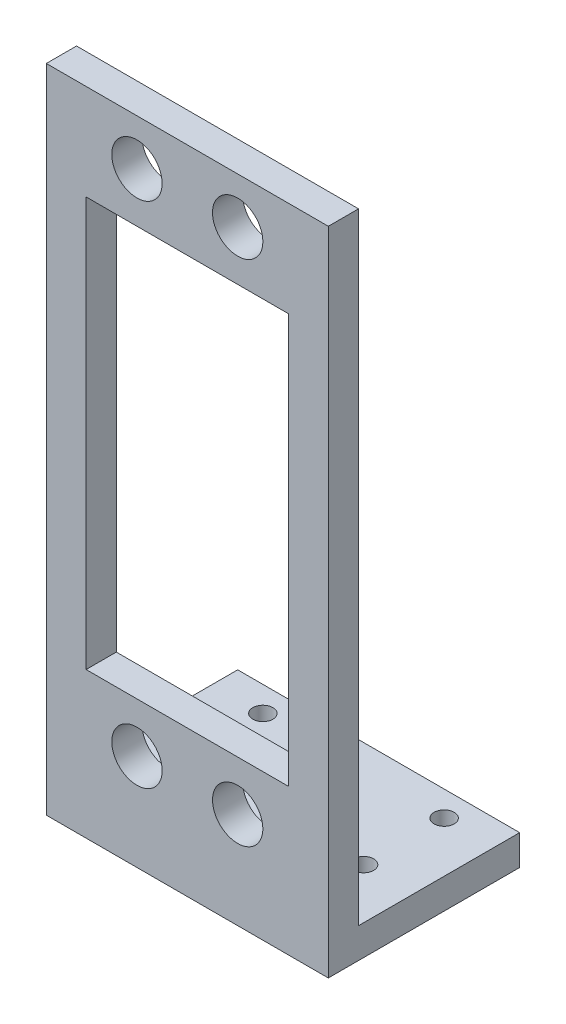
ISO-10303-21;
HEADER;
FILE_DESCRIPTION(('STEP AP214'),'2;1');
FILE_NAME('part.step','',(''),(''),'','','');
FILE_SCHEMA(('AUTOMOTIVE_DESIGN { 1 0 10303 214 1 1 1 1 }'));
ENDSEC;
DATA;
#1=APPLICATION_CONTEXT('core data for automotive mechanical design processes');
#2=APPLICATION_PROTOCOL_DEFINITION('international standard','automotive_design',2000,#1);
#3=PRODUCT_CONTEXT('',#1,'mechanical');
#4=PRODUCT('Part','Part','',(#3));
#5=PRODUCT_RELATED_PRODUCT_CATEGORY('part','',(#4));
#6=PRODUCT_DEFINITION_FORMATION('','',#4);
#7=PRODUCT_DEFINITION_CONTEXT('part definition',#1,'design');
#8=PRODUCT_DEFINITION('design','',#6,#7);
#9=PRODUCT_DEFINITION_SHAPE('','',#8);
#10=(LENGTH_UNIT() NAMED_UNIT(*) SI_UNIT(.MILLI.,.METRE.));
#11=(NAMED_UNIT(*) PLANE_ANGLE_UNIT() SI_UNIT($,.RADIAN.));
#12=(NAMED_UNIT(*) SI_UNIT($,.STERADIAN.) SOLID_ANGLE_UNIT());
#13=UNCERTAINTY_MEASURE_WITH_UNIT(LENGTH_MEASURE(1.E-05),#10,'distance_accuracy_value','');
#14=(GEOMETRIC_REPRESENTATION_CONTEXT(3) GLOBAL_UNCERTAINTY_ASSIGNED_CONTEXT((#13)) GLOBAL_UNIT_ASSIGNED_CONTEXT((#10,
#11,#12)) REPRESENTATION_CONTEXT('',''));
#15=CARTESIAN_POINT('',(0.,0.,0.));
#16=DIRECTION('',(0.,0.,1.));
#17=DIRECTION('',(1.,0.,0.));
#18=AXIS2_PLACEMENT_3D('',#15,#16,#17);
#19=CARTESIAN_POINT('',(0.,0.,0.));
#20=DIRECTION('',(0.,0.,1.));
#21=DIRECTION('',(1.,0.,0.));
#22=AXIS2_PLACEMENT_3D('',#19,#20,#21);
#23=PLANE('',#22);
#24=CARTESIAN_POINT('',(9.,9.57000000000001,0.));
#25=DIRECTION('',(0.,0.,1.));
#26=DIRECTION('',(1.,0.,0.));
#27=AXIS2_PLACEMENT_3D('',#24,#25,#26);
#28=CIRCLE('',#27,2.5);
#29=CARTESIAN_POINT('',(11.5,9.57000000000001,0.));
#30=VERTEX_POINT('',#29);
#31=EDGE_CURVE('E178',#30,#30,#28,.T.);
#32=ORIENTED_EDGE('',*,*,#31,.T.);
#33=EDGE_LOOP('',(#32));
#34=FACE_BOUND('',#33,.T.);
#35=CARTESIAN_POINT('',(19.,60.07,0.));
#36=DIRECTION('',(0.,0.,1.));
#37=DIRECTION('',(1.,0.,0.));
#38=AXIS2_PLACEMENT_3D('',#35,#36,#37);
#39=CIRCLE('',#38,2.5);
#40=CARTESIAN_POINT('',(21.5,60.07,0.));
#41=VERTEX_POINT('',#40);
#42=EDGE_CURVE('E160',#41,#41,#39,.T.);
#43=ORIENTED_EDGE('',*,*,#42,.T.);
#44=EDGE_LOOP('',(#43));
#45=FACE_BOUND('',#44,.T.);
#46=CARTESIAN_POINT('',(9.,60.07,0.));
#47=DIRECTION('',(0.,0.,1.));
#48=DIRECTION('',(1.,0.,0.));
#49=AXIS2_PLACEMENT_3D('',#46,#47,#48);
#50=CIRCLE('',#49,2.5);
#51=CARTESIAN_POINT('',(11.5,60.07,0.));
#52=VERTEX_POINT('',#51);
#53=EDGE_CURVE('E173',#52,#52,#50,.T.);
#54=ORIENTED_EDGE('',*,*,#53,.T.);
#55=EDGE_LOOP('',(#54));
#56=FACE_BOUND('',#55,.T.);
#57=CARTESIAN_POINT('',(19.,9.57000000000001,0.));
#58=DIRECTION('',(0.,0.,1.));
#59=DIRECTION('',(1.,0.,0.));
#60=AXIS2_PLACEMENT_3D('',#57,#58,#59);
#61=CIRCLE('',#60,2.49999999999999);
#62=CARTESIAN_POINT('',(21.5,9.57000000000001,0.));
#63=VERTEX_POINT('',#62);
#64=EDGE_CURVE('E166',#63,#63,#61,.T.);
#65=ORIENTED_EDGE('',*,*,#64,.T.);
#66=EDGE_LOOP('',(#65));
#67=FACE_BOUND('',#66,.T.);
#68=DIRECTION('',(1.,0.,0.));
#69=VECTOR('',#68,1.);
#70=CARTESIAN_POINT('',(0.,14.5,0.));
#71=LINE('',#70,#69);
#72=CARTESIAN_POINT('',(3.95,14.5,0.));
#73=VERTEX_POINT('',#72);
#74=CARTESIAN_POINT('',(24.05,14.5,0.));
#75=VERTEX_POINT('',#74);
#76=EDGE_CURVE('E42',#73,#75,#71,.T.);
#77=ORIENTED_EDGE('',*,*,#76,.T.);
#78=DIRECTION('',(0.,1.,0.));
#79=VECTOR('',#78,1.);
#80=CARTESIAN_POINT('',(24.05,0.,0.));
#81=LINE('',#80,#79);
#82=CARTESIAN_POINT('',(24.05,55.14,0.));
#83=VERTEX_POINT('',#82);
#84=EDGE_CURVE('E11',#75,#83,#81,.T.);
#85=ORIENTED_EDGE('',*,*,#84,.T.);
#86=DIRECTION('',(-1.,0.,0.));
#87=VECTOR('',#86,1.);
#88=CARTESIAN_POINT('',(0.,55.14,0.));
#89=LINE('',#88,#87);
#90=CARTESIAN_POINT('',(3.95,55.14,0.));
#91=VERTEX_POINT('',#90);
#92=EDGE_CURVE('E206',#83,#91,#89,.T.);
#93=ORIENTED_EDGE('',*,*,#92,.T.);
#94=DIRECTION('',(0.,-1.,0.));
#95=VECTOR('',#94,1.);
#96=CARTESIAN_POINT('',(3.95,0.,0.));
#97=LINE('',#96,#95);
#98=EDGE_CURVE('E209',#91,#73,#97,.T.);
#99=ORIENTED_EDGE('',*,*,#98,.T.);
#100=EDGE_LOOP('',(#77,#85,#93,#99));
#101=FACE_BOUND('',#100,.T.);
#102=DIRECTION('',(1.,0.,0.));
#103=VECTOR('',#102,1.);
#104=CARTESIAN_POINT('',(0.,3.,0.));
#105=LINE('',#104,#103);
#106=CARTESIAN_POINT('',(0.,3.,0.));
#107=VERTEX_POINT('',#106);
#108=CARTESIAN_POINT('',(28.,3.,0.));
#109=VERTEX_POINT('',#108);
#110=EDGE_CURVE('E49',#107,#109,#105,.T.);
#111=ORIENTED_EDGE('',*,*,#110,.F.);
#112=DIRECTION('',(0.,-1.,0.));
#113=VECTOR('',#112,1.);
#114=CARTESIAN_POINT('',(0.,0.,0.));
#115=LINE('',#114,#113);
#116=CARTESIAN_POINT('',(0.,64.64,0.));
#117=VERTEX_POINT('',#116);
#118=EDGE_CURVE('E136',#117,#107,#115,.T.);
#119=ORIENTED_EDGE('',*,*,#118,.F.);
#120=DIRECTION('',(-1.,0.,0.));
#121=VECTOR('',#120,1.);
#122=CARTESIAN_POINT('',(0.,64.64,0.));
#123=LINE('',#122,#121);
#124=CARTESIAN_POINT('',(28.,64.64,0.));
#125=VERTEX_POINT('',#124);
#126=EDGE_CURVE('E195',#125,#117,#123,.T.);
#127=ORIENTED_EDGE('',*,*,#126,.F.);
#128=DIRECTION('',(0.,1.,0.));
#129=VECTOR('',#128,1.);
#130=CARTESIAN_POINT('',(28.,0.,0.));
#131=LINE('',#130,#129);
#132=EDGE_CURVE('E181',#109,#125,#131,.T.);
#133=ORIENTED_EDGE('',*,*,#132,.F.);
#134=EDGE_LOOP('',(#111,#119,#127,#133));
#135=FACE_BOUND('',#134,.T.);
#136=ADVANCED_FACE('F34',(#34,#45,#56,#67,#101,#135),#23,.F.);
#137=CARTESIAN_POINT('',(0.,0.,3.));
#138=DIRECTION('',(0.,1.,0.));
#139=DIRECTION('',(0.,0.,1.));
#140=AXIS2_PLACEMENT_3D('',#137,#138,#139);
#141=PLANE('',#140);
#142=CARTESIAN_POINT('',(23.,0.,-5.5));
#143=DIRECTION('',(0.,1.,0.));
#144=DIRECTION('',(0.,0.,1.));
#145=AXIS2_PLACEMENT_3D('',#142,#143,#144);
#146=CIRCLE('',#145,1.);
#147=CARTESIAN_POINT('',(23.,0.,-4.5));
#148=VERTEX_POINT('',#147);
#149=EDGE_CURVE('E269',#148,#148,#146,.T.);
#150=ORIENTED_EDGE('',*,*,#149,.T.);
#151=EDGE_LOOP('',(#150));
#152=FACE_BOUND('',#151,.T.);
#153=CARTESIAN_POINT('',(23.,0.,-13.5));
#154=DIRECTION('',(0.,1.,0.));
#155=DIRECTION('',(0.,0.,1.));
#156=AXIS2_PLACEMENT_3D('',#153,#154,#155);
#157=CIRCLE('',#156,1.);
#158=CARTESIAN_POINT('',(23.,0.,-12.5));
#159=VERTEX_POINT('',#158);
#160=EDGE_CURVE('E271',#159,#159,#157,.T.);
#161=ORIENTED_EDGE('',*,*,#160,.T.);
#162=EDGE_LOOP('',(#161));
#163=FACE_BOUND('',#162,.T.);
#164=CARTESIAN_POINT('',(5.,0.,-13.5));
#165=DIRECTION('',(0.,1.,0.));
#166=DIRECTION('',(0.,0.,1.));
#167=AXIS2_PLACEMENT_3D('',#164,#165,#166);
#168=CIRCLE('',#167,1.);
#169=CARTESIAN_POINT('',(5.,0.,-12.5));
#170=VERTEX_POINT('',#169);
#171=EDGE_CURVE('E275',#170,#170,#168,.T.);
#172=ORIENTED_EDGE('',*,*,#171,.T.);
#173=EDGE_LOOP('',(#172));
#174=FACE_BOUND('',#173,.T.);
#175=CARTESIAN_POINT('',(5.,0.,-5.5));
#176=DIRECTION('',(0.,1.,0.));
#177=DIRECTION('',(0.,0.,1.));
#178=AXIS2_PLACEMENT_3D('',#175,#176,#177);
#179=CIRCLE('',#178,0.999999999999998);
#180=CARTESIAN_POINT('',(5.,0.,-4.5));
#181=VERTEX_POINT('',#180);
#182=EDGE_CURVE('E280',#181,#181,#179,.T.);
#183=ORIENTED_EDGE('',*,*,#182,.T.);
#184=EDGE_LOOP('',(#183));
#185=FACE_BOUND('',#184,.T.);
#186=DIRECTION('',(0.,0.,-1.));
#187=VECTOR('',#186,1.);
#188=CARTESIAN_POINT('',(0.,0.,3.));
#189=LINE('',#188,#187);
#190=CARTESIAN_POINT('',(0.,0.,3.));
#191=VERTEX_POINT('',#190);
#192=CARTESIAN_POINT('',(0.,0.,-16.));
#193=VERTEX_POINT('',#192);
#194=EDGE_CURVE('E193',#191,#193,#189,.T.);
#195=ORIENTED_EDGE('',*,*,#194,.T.);
#196=DIRECTION('',(-1.,0.,0.));
#197=VECTOR('',#196,1.);
#198=CARTESIAN_POINT('',(0.,0.,-16.));
#199=LINE('',#198,#197);
#200=CARTESIAN_POINT('',(28.,0.,-16.));
#201=VERTEX_POINT('',#200);
#202=EDGE_CURVE('E130',#201,#193,#199,.T.);
#203=ORIENTED_EDGE('',*,*,#202,.F.);
#204=DIRECTION('',(0.,0.,-1.));
#205=VECTOR('',#204,1.);
#206=CARTESIAN_POINT('',(28.,0.,3.));
#207=LINE('',#206,#205);
#208=CARTESIAN_POINT('',(28.,0.,3.));
#209=VERTEX_POINT('',#208);
#210=EDGE_CURVE('E204',#209,#201,#207,.T.);
#211=ORIENTED_EDGE('',*,*,#210,.F.);
#212=DIRECTION('',(1.,0.,0.));
#213=VECTOR('',#212,1.);
#214=CARTESIAN_POINT('',(0.,0.,3.));
#215=LINE('',#214,#213);
#216=EDGE_CURVE('E184',#191,#209,#215,.T.);
#217=ORIENTED_EDGE('',*,*,#216,.F.);
#218=EDGE_LOOP('',(#195,#203,#211,#217));
#219=FACE_BOUND('',#218,.T.);
#220=ADVANCED_FACE('F36',(#152,#163,#174,#185,#219),#141,.F.);
#221=CARTESIAN_POINT('',(28.,0.,3.));
#222=DIRECTION('',(-1.,0.,0.));
#223=DIRECTION('',(0.,-1.,0.));
#224=AXIS2_PLACEMENT_3D('',#221,#222,#223);
#225=PLANE('',#224);
#226=ORIENTED_EDGE('',*,*,#210,.T.);
#227=DIRECTION('',(0.,-1.,0.));
#228=VECTOR('',#227,1.);
#229=CARTESIAN_POINT('',(28.,0.,-16.));
#230=LINE('',#229,#228);
#231=CARTESIAN_POINT('',(28.,3.,-16.));
#232=VERTEX_POINT('',#231);
#233=EDGE_CURVE('E123',#232,#201,#230,.T.);
#234=ORIENTED_EDGE('',*,*,#233,.F.);
#235=DIRECTION('',(0.,0.,1.));
#236=VECTOR('',#235,1.);
#237=CARTESIAN_POINT('',(28.,3.,-16.));
#238=LINE('',#237,#236);
#239=EDGE_CURVE('E119',#232,#109,#238,.T.);
#240=ORIENTED_EDGE('',*,*,#239,.T.);
#241=ORIENTED_EDGE('',*,*,#132,.T.);
#242=DIRECTION('',(0.,0.,-1.));
#243=VECTOR('',#242,1.);
#244=CARTESIAN_POINT('',(28.,64.64,3.));
#245=LINE('',#244,#243);
#246=CARTESIAN_POINT('',(28.,64.64,3.));
#247=VERTEX_POINT('',#246);
#248=EDGE_CURVE('E201',#247,#125,#245,.T.);
#249=ORIENTED_EDGE('',*,*,#248,.F.);
#250=DIRECTION('',(0.,1.,0.));
#251=VECTOR('',#250,1.);
#252=CARTESIAN_POINT('',(28.,0.,3.));
#253=LINE('',#252,#251);
#254=EDGE_CURVE('E187',#209,#247,#253,.T.);
#255=ORIENTED_EDGE('',*,*,#254,.F.);
#256=EDGE_LOOP('',(#226,#234,#240,#241,#249,#255));
#257=FACE_BOUND('',#256,.T.);
#258=ADVANCED_FACE('F248',(#257),#225,.F.);
#259=CARTESIAN_POINT('',(0.,64.64,3.));
#260=DIRECTION('',(0.,-1.,0.));
#261=DIRECTION('',(0.,0.,-1.));
#262=AXIS2_PLACEMENT_3D('',#259,#260,#261);
#263=PLANE('',#262);
#264=ORIENTED_EDGE('',*,*,#126,.T.);
#265=DIRECTION('',(0.,0.,-1.));
#266=VECTOR('',#265,1.);
#267=CARTESIAN_POINT('',(0.,64.64,3.));
#268=LINE('',#267,#266);
#269=CARTESIAN_POINT('',(0.,64.64,3.));
#270=VERTEX_POINT('',#269);
#271=EDGE_CURVE('E199',#270,#117,#268,.T.);
#272=ORIENTED_EDGE('',*,*,#271,.F.);
#273=DIRECTION('',(-1.,0.,0.));
#274=VECTOR('',#273,1.);
#275=CARTESIAN_POINT('',(0.,64.64,3.));
#276=LINE('',#275,#274);
#277=EDGE_CURVE('E189',#247,#270,#276,.T.);
#278=ORIENTED_EDGE('',*,*,#277,.F.);
#279=ORIENTED_EDGE('',*,*,#248,.T.);
#280=EDGE_LOOP('',(#264,#272,#278,#279));
#281=FACE_BOUND('',#280,.T.);
#282=ADVANCED_FACE('F256',(#281),#263,.F.);
#283=CARTESIAN_POINT('',(0.,0.,3.));
#284=DIRECTION('',(1.,0.,0.));
#285=DIRECTION('',(0.,0.,-1.));
#286=AXIS2_PLACEMENT_3D('',#283,#284,#285);
#287=PLANE('',#286);
#288=ORIENTED_EDGE('',*,*,#118,.T.);
#289=DIRECTION('',(0.,0.,1.));
#290=VECTOR('',#289,1.);
#291=CARTESIAN_POINT('',(0.,3.,-16.));
#292=LINE('',#291,#290);
#293=CARTESIAN_POINT('',(0.,3.,-16.));
#294=VERTEX_POINT('',#293);
#295=EDGE_CURVE('E117',#294,#107,#292,.T.);
#296=ORIENTED_EDGE('',*,*,#295,.F.);
#297=DIRECTION('',(0.,1.,0.));
#298=VECTOR('',#297,1.);
#299=CARTESIAN_POINT('',(0.,0.,-16.));
#300=LINE('',#299,#298);
#301=EDGE_CURVE('E124',#193,#294,#300,.T.);
#302=ORIENTED_EDGE('',*,*,#301,.F.);
#303=ORIENTED_EDGE('',*,*,#194,.F.);
#304=DIRECTION('',(0.,-1.,0.));
#305=VECTOR('',#304,1.);
#306=CARTESIAN_POINT('',(0.,0.,3.));
#307=LINE('',#306,#305);
#308=EDGE_CURVE('E191',#270,#191,#307,.T.);
#309=ORIENTED_EDGE('',*,*,#308,.F.);
#310=ORIENTED_EDGE('',*,*,#271,.T.);
#311=EDGE_LOOP('',(#288,#296,#302,#303,#309,#310));
#312=FACE_BOUND('',#311,.T.);
#313=ADVANCED_FACE('F134',(#312),#287,.F.);
#314=CARTESIAN_POINT('',(0.,0.,3.));
#315=DIRECTION('',(0.,0.,1.));
#316=DIRECTION('',(1.,0.,0.));
#317=AXIS2_PLACEMENT_3D('',#314,#315,#316);
#318=PLANE('',#317);
#319=DIRECTION('',(0.,1.,0.));
#320=VECTOR('',#319,1.);
#321=CARTESIAN_POINT('',(24.05,55.14,3.));
#322=LINE('',#321,#320);
#323=CARTESIAN_POINT('',(24.05,14.5,3.));
#324=VERTEX_POINT('',#323);
#325=CARTESIAN_POINT('',(24.05,55.14,3.));
#326=VERTEX_POINT('',#325);
#327=EDGE_CURVE('E57',#324,#326,#322,.T.);
#328=ORIENTED_EDGE('',*,*,#327,.F.);
#329=DIRECTION('',(1.,0.,0.));
#330=VECTOR('',#329,1.);
#331=CARTESIAN_POINT('',(24.05,14.5,3.));
#332=LINE('',#331,#330);
#333=CARTESIAN_POINT('',(3.95,14.5,3.));
#334=VERTEX_POINT('',#333);
#335=EDGE_CURVE('E148',#334,#324,#332,.T.);
#336=ORIENTED_EDGE('',*,*,#335,.F.);
#337=DIRECTION('',(0.,-1.,0.));
#338=VECTOR('',#337,1.);
#339=CARTESIAN_POINT('',(3.95,55.14,3.));
#340=LINE('',#339,#338);
#341=CARTESIAN_POINT('',(3.95,55.14,3.));
#342=VERTEX_POINT('',#341);
#343=EDGE_CURVE('E145',#342,#334,#340,.T.);
#344=ORIENTED_EDGE('',*,*,#343,.F.);
#345=DIRECTION('',(-1.,0.,0.));
#346=VECTOR('',#345,1.);
#347=CARTESIAN_POINT('',(24.05,55.14,3.));
#348=LINE('',#347,#346);
#349=EDGE_CURVE('E138',#326,#342,#348,.T.);
#350=ORIENTED_EDGE('',*,*,#349,.F.);
#351=EDGE_LOOP('',(#328,#336,#344,#350));
#352=FACE_BOUND('',#351,.T.);
#353=CARTESIAN_POINT('',(19.,9.57000000000001,3.));
#354=DIRECTION('',(0.,0.,1.));
#355=DIRECTION('',(1.,0.,0.));
#356=AXIS2_PLACEMENT_3D('',#353,#354,#355);
#357=CIRCLE('',#356,2.49999999999999);
#358=CARTESIAN_POINT('',(21.5,9.57000000000001,3.));
#359=VERTEX_POINT('',#358);
#360=EDGE_CURVE('E170',#359,#359,#357,.T.);
#361=ORIENTED_EDGE('',*,*,#360,.F.);
#362=EDGE_LOOP('',(#361));
#363=FACE_BOUND('',#362,.T.);
#364=CARTESIAN_POINT('',(9.,60.07,3.));
#365=DIRECTION('',(0.,0.,1.));
#366=DIRECTION('',(1.,0.,0.));
#367=AXIS2_PLACEMENT_3D('',#364,#365,#366);
#368=CIRCLE('',#367,2.5);
#369=CARTESIAN_POINT('',(11.5,60.07,3.));
#370=VERTEX_POINT('',#369);
#371=EDGE_CURVE('E163',#370,#370,#368,.T.);
#372=ORIENTED_EDGE('',*,*,#371,.F.);
#373=EDGE_LOOP('',(#372));
#374=FACE_BOUND('',#373,.T.);
#375=CARTESIAN_POINT('',(19.,60.07,3.));
#376=DIRECTION('',(0.,0.,1.));
#377=DIRECTION('',(1.,0.,0.));
#378=AXIS2_PLACEMENT_3D('',#375,#376,#377);
#379=CIRCLE('',#378,2.5);
#380=CARTESIAN_POINT('',(21.5,60.07,3.));
#381=VERTEX_POINT('',#380);
#382=EDGE_CURVE('E154',#381,#381,#379,.T.);
#383=ORIENTED_EDGE('',*,*,#382,.F.);
#384=EDGE_LOOP('',(#383));
#385=FACE_BOUND('',#384,.T.);
#386=CARTESIAN_POINT('',(9.,9.57000000000001,3.));
#387=DIRECTION('',(0.,0.,1.));
#388=DIRECTION('',(1.,0.,0.));
#389=AXIS2_PLACEMENT_3D('',#386,#387,#388);
#390=CIRCLE('',#389,2.5);
#391=CARTESIAN_POINT('',(11.5,9.57000000000001,3.));
#392=VERTEX_POINT('',#391);
#393=EDGE_CURVE('E169',#392,#392,#390,.T.);
#394=ORIENTED_EDGE('',*,*,#393,.F.);
#395=EDGE_LOOP('',(#394));
#396=FACE_BOUND('',#395,.T.);
#397=ORIENTED_EDGE('',*,*,#216,.T.);
#398=ORIENTED_EDGE('',*,*,#254,.T.);
#399=ORIENTED_EDGE('',*,*,#277,.T.);
#400=ORIENTED_EDGE('',*,*,#308,.T.);
#401=EDGE_LOOP('',(#397,#398,#399,#400));
#402=FACE_BOUND('',#401,.T.);
#403=ADVANCED_FACE('F224',(#352,#363,#374,#385,#396,#402),#318,.T.);
#404=CARTESIAN_POINT('',(9.,9.57000000000001,0.));
#405=DIRECTION('',(0.,0.,1.));
#406=DIRECTION('',(1.,0.,0.));
#407=AXIS2_PLACEMENT_3D('',#404,#405,#406);
#408=CYLINDRICAL_SURFACE('',#407,2.5);
#409=ORIENTED_EDGE('',*,*,#31,.F.);
#410=EDGE_LOOP('',(#409));
#411=FACE_BOUND('',#410,.T.);
#412=ORIENTED_EDGE('',*,*,#393,.T.);
#413=EDGE_LOOP('',(#412));
#414=FACE_BOUND('',#413,.T.);
#415=ADVANCED_FACE('F380',(#411,#414),#408,.F.);
#416=CARTESIAN_POINT('',(19.,60.07,0.));
#417=DIRECTION('',(0.,0.,1.));
#418=DIRECTION('',(1.,0.,0.));
#419=AXIS2_PLACEMENT_3D('',#416,#417,#418);
#420=CYLINDRICAL_SURFACE('',#419,2.5);
#421=ORIENTED_EDGE('',*,*,#42,.F.);
#422=EDGE_LOOP('',(#421));
#423=FACE_BOUND('',#422,.T.);
#424=ORIENTED_EDGE('',*,*,#382,.T.);
#425=EDGE_LOOP('',(#424));
#426=FACE_BOUND('',#425,.T.);
#427=ADVANCED_FACE('F388',(#423,#426),#420,.F.);
#428=CARTESIAN_POINT('',(9.,60.07,0.));
#429=DIRECTION('',(0.,0.,1.));
#430=DIRECTION('',(1.,0.,0.));
#431=AXIS2_PLACEMENT_3D('',#428,#429,#430);
#432=CYLINDRICAL_SURFACE('',#431,2.5);
#433=ORIENTED_EDGE('',*,*,#53,.F.);
#434=EDGE_LOOP('',(#433));
#435=FACE_BOUND('',#434,.T.);
#436=ORIENTED_EDGE('',*,*,#371,.T.);
#437=EDGE_LOOP('',(#436));
#438=FACE_BOUND('',#437,.T.);
#439=ADVANCED_FACE('F237',(#435,#438),#432,.F.);
#440=CARTESIAN_POINT('',(19.,9.57000000000001,0.));
#441=DIRECTION('',(0.,0.,1.));
#442=DIRECTION('',(1.,0.,0.));
#443=AXIS2_PLACEMENT_3D('',#440,#441,#442);
#444=CYLINDRICAL_SURFACE('',#443,2.49999999999999);
#445=ORIENTED_EDGE('',*,*,#64,.F.);
#446=EDGE_LOOP('',(#445));
#447=FACE_BOUND('',#446,.T.);
#448=ORIENTED_EDGE('',*,*,#360,.T.);
#449=EDGE_LOOP('',(#448));
#450=FACE_BOUND('',#449,.T.);
#451=ADVANCED_FACE('F230',(#447,#450),#444,.F.);
#452=CARTESIAN_POINT('',(24.05,55.14,-7.));
#453=DIRECTION('',(1.,0.,0.));
#454=DIRECTION('',(0.,1.,0.));
#455=AXIS2_PLACEMENT_3D('',#452,#453,#454);
#456=PLANE('',#455);
#457=DIRECTION('',(0.,0.,1.));
#458=VECTOR('',#457,1.);
#459=CARTESIAN_POINT('',(24.05,14.5,-7.));
#460=LINE('',#459,#458);
#461=EDGE_CURVE('E152',#75,#324,#460,.T.);
#462=ORIENTED_EDGE('',*,*,#461,.T.);
#463=ORIENTED_EDGE('',*,*,#327,.T.);
#464=DIRECTION('',(0.,0.,1.));
#465=VECTOR('',#464,1.);
#466=CARTESIAN_POINT('',(24.05,55.14,-7.));
#467=LINE('',#466,#465);
#468=EDGE_CURVE('E151',#83,#326,#467,.T.);
#469=ORIENTED_EDGE('',*,*,#468,.F.);
#470=ORIENTED_EDGE('',*,*,#84,.F.);
#471=EDGE_LOOP('',(#462,#463,#469,#470));
#472=FACE_BOUND('',#471,.T.);
#473=ADVANCED_FACE('F228',(#472),#456,.F.);
#474=CARTESIAN_POINT('',(24.05,14.5,-7.));
#475=DIRECTION('',(0.,-1.,0.));
#476=DIRECTION('',(1.,0.,0.));
#477=AXIS2_PLACEMENT_3D('',#474,#475,#476);
#478=PLANE('',#477);
#479=DIRECTION('',(0.,0.,1.));
#480=VECTOR('',#479,1.);
#481=CARTESIAN_POINT('',(3.95,14.5,-7.));
#482=LINE('',#481,#480);
#483=EDGE_CURVE('E155',#73,#334,#482,.T.);
#484=ORIENTED_EDGE('',*,*,#483,.T.);
#485=ORIENTED_EDGE('',*,*,#335,.T.);
#486=ORIENTED_EDGE('',*,*,#461,.F.);
#487=ORIENTED_EDGE('',*,*,#76,.F.);
#488=EDGE_LOOP('',(#484,#485,#486,#487));
#489=FACE_BOUND('',#488,.T.);
#490=ADVANCED_FACE('F217',(#489),#478,.F.);
#491=CARTESIAN_POINT('',(3.95,55.14,-7.));
#492=DIRECTION('',(-1.,0.,0.));
#493=DIRECTION('',(0.,-1.,0.));
#494=AXIS2_PLACEMENT_3D('',#491,#492,#493);
#495=PLANE('',#494);
#496=DIRECTION('',(0.,0.,1.));
#497=VECTOR('',#496,1.);
#498=CARTESIAN_POINT('',(3.95,55.14,-7.));
#499=LINE('',#498,#497);
#500=EDGE_CURVE('E157',#91,#342,#499,.T.);
#501=ORIENTED_EDGE('',*,*,#500,.T.);
#502=ORIENTED_EDGE('',*,*,#343,.T.);
#503=ORIENTED_EDGE('',*,*,#483,.F.);
#504=ORIENTED_EDGE('',*,*,#98,.F.);
#505=EDGE_LOOP('',(#501,#502,#503,#504));
#506=FACE_BOUND('',#505,.T.);
#507=ADVANCED_FACE('F219',(#506),#495,.F.);
#508=CARTESIAN_POINT('',(24.05,55.14,-7.));
#509=DIRECTION('',(0.,1.,0.));
#510=DIRECTION('',(0.,0.,1.));
#511=AXIS2_PLACEMENT_3D('',#508,#509,#510);
#512=PLANE('',#511);
#513=ORIENTED_EDGE('',*,*,#468,.T.);
#514=ORIENTED_EDGE('',*,*,#349,.T.);
#515=ORIENTED_EDGE('',*,*,#500,.F.);
#516=ORIENTED_EDGE('',*,*,#92,.F.);
#517=EDGE_LOOP('',(#513,#514,#515,#516));
#518=FACE_BOUND('',#517,.T.);
#519=ADVANCED_FACE('F227',(#518),#512,.F.);
#520=CARTESIAN_POINT('',(0.,3.,-16.));
#521=DIRECTION('',(0.,-1.,0.));
#522=DIRECTION('',(1.,0.,0.));
#523=AXIS2_PLACEMENT_3D('',#520,#521,#522);
#524=PLANE('',#523);
#525=CARTESIAN_POINT('',(23.,3.,-5.5));
#526=DIRECTION('',(0.,1.,0.));
#527=DIRECTION('',(-1.,0.,0.));
#528=AXIS2_PLACEMENT_3D('',#525,#526,#527);
#529=CIRCLE('',#528,1.);
#530=CARTESIAN_POINT('',(22.,3.,-5.5));
#531=VERTEX_POINT('',#530);
#532=EDGE_CURVE('E287',#531,#531,#529,.T.);
#533=ORIENTED_EDGE('',*,*,#532,.F.);
#534=EDGE_LOOP('',(#533));
#535=FACE_BOUND('',#534,.T.);
#536=CARTESIAN_POINT('',(23.,3.,-13.5));
#537=DIRECTION('',(0.,1.,0.));
#538=DIRECTION('',(-1.,0.,0.));
#539=AXIS2_PLACEMENT_3D('',#536,#537,#538);
#540=CIRCLE('',#539,1.);
#541=CARTESIAN_POINT('',(22.,3.,-13.5));
#542=VERTEX_POINT('',#541);
#543=EDGE_CURVE('E290',#542,#542,#540,.T.);
#544=ORIENTED_EDGE('',*,*,#543,.F.);
#545=EDGE_LOOP('',(#544));
#546=FACE_BOUND('',#545,.T.);
#547=CARTESIAN_POINT('',(5.,3.,-13.5));
#548=DIRECTION('',(0.,1.,0.));
#549=DIRECTION('',(-1.,0.,0.));
#550=AXIS2_PLACEMENT_3D('',#547,#548,#549);
#551=CIRCLE('',#550,1.);
#552=CARTESIAN_POINT('',(4.,3.,-13.5));
#553=VERTEX_POINT('',#552);
#554=EDGE_CURVE('E286',#553,#553,#551,.T.);
#555=ORIENTED_EDGE('',*,*,#554,.F.);
#556=EDGE_LOOP('',(#555));
#557=FACE_BOUND('',#556,.T.);
#558=CARTESIAN_POINT('',(5.,3.,-5.5));
#559=DIRECTION('',(0.,1.,0.));
#560=DIRECTION('',(-1.,0.,0.));
#561=AXIS2_PLACEMENT_3D('',#558,#559,#560);
#562=CIRCLE('',#561,0.999999999999998);
#563=CARTESIAN_POINT('',(4.,3.,-5.5));
#564=VERTEX_POINT('',#563);
#565=EDGE_CURVE('E283',#564,#564,#562,.T.);
#566=ORIENTED_EDGE('',*,*,#565,.F.);
#567=EDGE_LOOP('',(#566));
#568=FACE_BOUND('',#567,.T.);
#569=ORIENTED_EDGE('',*,*,#110,.T.);
#570=ORIENTED_EDGE('',*,*,#239,.F.);
#571=DIRECTION('',(1.,0.,0.));
#572=VECTOR('',#571,1.);
#573=CARTESIAN_POINT('',(0.,3.,-16.));
#574=LINE('',#573,#572);
#575=EDGE_CURVE('E113',#294,#232,#574,.T.);
#576=ORIENTED_EDGE('',*,*,#575,.F.);
#577=ORIENTED_EDGE('',*,*,#295,.T.);
#578=EDGE_LOOP('',(#569,#570,#576,#577));
#579=FACE_BOUND('',#578,.T.);
#580=ADVANCED_FACE('F115',(#535,#546,#557,#568,#579),#524,.F.);
#581=CARTESIAN_POINT('',(0.,0.,-16.));
#582=DIRECTION('',(0.,0.,-1.));
#583=DIRECTION('',(-1.,0.,0.));
#584=AXIS2_PLACEMENT_3D('',#581,#582,#583);
#585=PLANE('',#584);
#586=ORIENTED_EDGE('',*,*,#301,.T.);
#587=ORIENTED_EDGE('',*,*,#575,.T.);
#588=ORIENTED_EDGE('',*,*,#233,.T.);
#589=ORIENTED_EDGE('',*,*,#202,.T.);
#590=EDGE_LOOP('',(#586,#587,#588,#589));
#591=FACE_BOUND('',#590,.T.);
#592=ADVANCED_FACE('F128',(#591),#585,.T.);
#593=CARTESIAN_POINT('',(5.,-7.,-5.5));
#594=DIRECTION('',(0.,1.,0.));
#595=DIRECTION('',(-1.,0.,0.));
#596=AXIS2_PLACEMENT_3D('',#593,#594,#595);
#597=CYLINDRICAL_SURFACE('',#596,0.999999999999998);
#598=ORIENTED_EDGE('',*,*,#565,.T.);
#599=EDGE_LOOP('',(#598));
#600=FACE_BOUND('',#599,.T.);
#601=ORIENTED_EDGE('',*,*,#182,.F.);
#602=EDGE_LOOP('',(#601));
#603=FACE_BOUND('',#602,.T.);
#604=ADVANCED_FACE('F305',(#600,#603),#597,.F.);
#605=CARTESIAN_POINT('',(5.,-7.,-13.5));
#606=DIRECTION('',(0.,1.,0.));
#607=DIRECTION('',(-1.,0.,0.));
#608=AXIS2_PLACEMENT_3D('',#605,#606,#607);
#609=CYLINDRICAL_SURFACE('',#608,1.);
#610=ORIENTED_EDGE('',*,*,#554,.T.);
#611=EDGE_LOOP('',(#610));
#612=FACE_BOUND('',#611,.T.);
#613=ORIENTED_EDGE('',*,*,#171,.F.);
#614=EDGE_LOOP('',(#613));
#615=FACE_BOUND('',#614,.T.);
#616=ADVANCED_FACE('F296',(#612,#615),#609,.F.);
#617=CARTESIAN_POINT('',(23.,-7.,-13.5));
#618=DIRECTION('',(0.,1.,0.));
#619=DIRECTION('',(-1.,0.,0.));
#620=AXIS2_PLACEMENT_3D('',#617,#618,#619);
#621=CYLINDRICAL_SURFACE('',#620,1.);
#622=ORIENTED_EDGE('',*,*,#543,.T.);
#623=EDGE_LOOP('',(#622));
#624=FACE_BOUND('',#623,.T.);
#625=ORIENTED_EDGE('',*,*,#160,.F.);
#626=EDGE_LOOP('',(#625));
#627=FACE_BOUND('',#626,.T.);
#628=ADVANCED_FACE('F315',(#624,#627),#621,.F.);
#629=CARTESIAN_POINT('',(23.,-7.,-5.5));
#630=DIRECTION('',(0.,1.,0.));
#631=DIRECTION('',(-1.,0.,0.));
#632=AXIS2_PLACEMENT_3D('',#629,#630,#631);
#633=CYLINDRICAL_SURFACE('',#632,1.);
#634=ORIENTED_EDGE('',*,*,#532,.T.);
#635=EDGE_LOOP('',(#634));
#636=FACE_BOUND('',#635,.T.);
#637=ORIENTED_EDGE('',*,*,#149,.F.);
#638=EDGE_LOOP('',(#637));
#639=FACE_BOUND('',#638,.T.);
#640=ADVANCED_FACE('F319',(#636,#639),#633,.F.);
#641=CLOSED_SHELL('',(#136,#220,#258,#282,#313,#403,#415,#427,#439,#451,#473,#490,#507,#519,
#580,#592,#604,#616,#628,#640));
#642=MANIFOLD_SOLID_BREP('B2',#641);
#643=ADVANCED_BREP_SHAPE_REPRESENTATION('',(#18,#642),#14);
#644=SHAPE_DEFINITION_REPRESENTATION(#9,#643);
ENDSEC;
END-ISO-10303-21;
